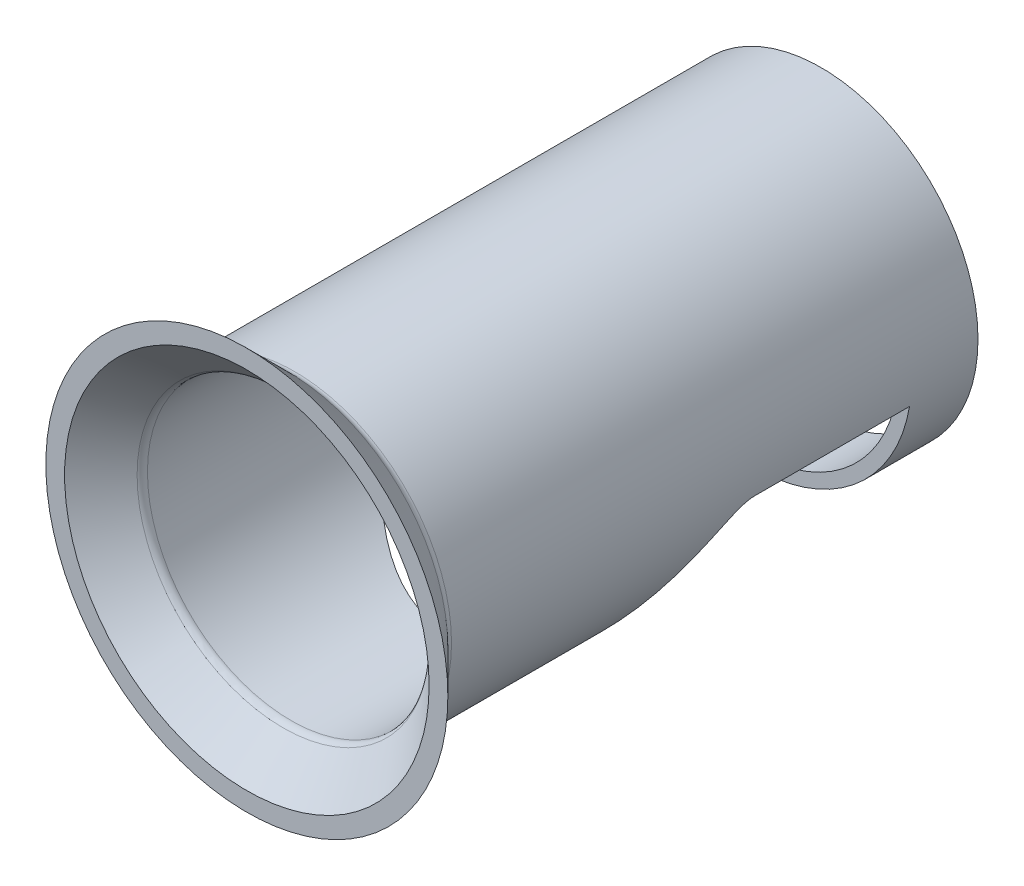
ISO-10303-21;
HEADER;
FILE_DESCRIPTION(('STEP AP214'),'2;1');
FILE_NAME('part.step','',(''),(''),'','','');
FILE_SCHEMA(('AUTOMOTIVE_DESIGN { 1 0 10303 214 1 1 1 1 }'));
ENDSEC;
DATA;
#1=APPLICATION_CONTEXT('core data for automotive mechanical design processes');
#2=APPLICATION_PROTOCOL_DEFINITION('international standard','automotive_design',2000,#1);
#3=PRODUCT_CONTEXT('',#1,'mechanical');
#4=PRODUCT('Part','Part','',(#3));
#5=PRODUCT_RELATED_PRODUCT_CATEGORY('part','',(#4));
#6=PRODUCT_DEFINITION_FORMATION('','',#4);
#7=PRODUCT_DEFINITION_CONTEXT('part definition',#1,'design');
#8=PRODUCT_DEFINITION('design','',#6,#7);
#9=PRODUCT_DEFINITION_SHAPE('','',#8);
#10=(LENGTH_UNIT() NAMED_UNIT(*) SI_UNIT(.MILLI.,.METRE.));
#11=(NAMED_UNIT(*) PLANE_ANGLE_UNIT() SI_UNIT($,.RADIAN.));
#12=(NAMED_UNIT(*) SI_UNIT($,.STERADIAN.) SOLID_ANGLE_UNIT());
#13=UNCERTAINTY_MEASURE_WITH_UNIT(LENGTH_MEASURE(1.E-05),#10,'distance_accuracy_value','');
#14=(GEOMETRIC_REPRESENTATION_CONTEXT(3) GLOBAL_UNCERTAINTY_ASSIGNED_CONTEXT((#13)) GLOBAL_UNIT_ASSIGNED_CONTEXT((#10,
#11,#12)) REPRESENTATION_CONTEXT('',''));
#15=CARTESIAN_POINT('',(0.,0.,0.));
#16=DIRECTION('',(0.,0.,1.));
#17=DIRECTION('',(1.,0.,0.));
#18=AXIS2_PLACEMENT_3D('',#15,#16,#17);
#19=CARTESIAN_POINT('',(0.,0.,0.));
#20=DIRECTION('',(0.,0.,1.));
#21=DIRECTION('',(1.,0.,0.));
#22=AXIS2_PLACEMENT_3D('',#19,#20,#21);
#23=PLANE('',#22);
#24=CARTESIAN_POINT('',(0.,0.,0.));
#25=DIRECTION('',(0.,0.,1.));
#26=DIRECTION('',(1.,0.,0.));
#27=AXIS2_PLACEMENT_3D('',#24,#25,#26);
#28=CIRCLE('',#27,17.75);
#29=CARTESIAN_POINT('',(17.75,0.,0.));
#30=VERTEX_POINT('',#29);
#31=EDGE_CURVE('E240',#30,#30,#28,.T.);
#32=ORIENTED_EDGE('',*,*,#31,.F.);
#33=EDGE_LOOP('',(#32));
#34=FACE_BOUND('',#33,.T.);
#35=CARTESIAN_POINT('',(0.,0.,0.));
#36=DIRECTION('',(0.,0.,1.));
#37=DIRECTION('',(1.,0.,0.));
#38=AXIS2_PLACEMENT_3D('',#35,#36,#37);
#39=CIRCLE('',#38,16.25);
#40=CARTESIAN_POINT('',(16.25,0.,0.));
#41=VERTEX_POINT('',#40);
#42=EDGE_CURVE('E152',#41,#41,#39,.T.);
#43=ORIENTED_EDGE('',*,*,#42,.T.);
#44=EDGE_LOOP('',(#43));
#45=FACE_BOUND('',#44,.T.);
#46=ADVANCED_FACE('F37',(#34,#45),#23,.F.);
#47=CARTESIAN_POINT('',(0.,0.,170.));
#48=DIRECTION('',(0.,0.,-1.));
#49=DIRECTION('',(-1.,0.,0.));
#50=AXIS2_PLACEMENT_3D('',#47,#48,#49);
#51=CYLINDRICAL_SURFACE('',#50,17.75);
#52=CARTESIAN_POINT('',(0.,0.,59.5857864376269));
#53=DIRECTION('',(0.,0.,1.));
#54=DIRECTION('',(1.,0.,0.));
#55=AXIS2_PLACEMENT_3D('',#52,#53,#54);
#56=CIRCLE('',#55,17.75);
#57=CARTESIAN_POINT('',(17.75,0.,59.5857864376269));
#58=VERTEX_POINT('',#57);
#59=EDGE_CURVE('E193',#58,#58,#56,.F.);
#60=ORIENTED_EDGE('',*,*,#59,.T.);
#61=EDGE_LOOP('',(#60));
#62=FACE_BOUND('',#61,.T.);
#63=DIRECTION('',(0.,0.,-1.));
#64=VECTOR('',#63,1.);
#65=CARTESIAN_POINT('',(-17.5,-2.9685855217595,170.));
#66=LINE('',#65,#64);
#67=CARTESIAN_POINT('',(-17.5,-2.9685855217595,7.50000000000001));
#68=VERTEX_POINT('',#67);
#69=CARTESIAN_POINT('',(-17.5,-2.96858552175949,25.));
#70=VERTEX_POINT('',#69);
#71=EDGE_CURVE('E178',#68,#70,#66,.F.);
#72=ORIENTED_EDGE('',*,*,#71,.T.);
#73=CARTESIAN_POINT('',(-17.5,-2.9685855217595,25.));
#74=CARTESIAN_POINT('',(-17.5000170392149,-2.96840485020913,25.1156571313001));
#75=CARTESIAN_POINT('',(-17.4988542765592,-2.97534203245867,25.2311649210221));
#76=CARTESIAN_POINT('',(-17.494317403572,-3.00194286008731,25.4601653083223));
#77=CARTESIAN_POINT('',(-17.4909531483648,-3.02154978367346,25.5736645824291));
#78=CARTESIAN_POINT('',(-17.482266525602,-3.07138944454455,25.7952437173956));
#79=CARTESIAN_POINT('',(-17.4769939554906,-3.10135114841929,25.9033882380726));
#80=CARTESIAN_POINT('',(-17.4646545023751,-3.17010825899014,26.1168105208855));
#81=CARTESIAN_POINT('',(-17.4575855665594,-3.20891376674544,26.2220848496523));
#82=CARTESIAN_POINT('',(-17.4324805866099,-3.34362132504211,26.5525481264265));
#83=CARTESIAN_POINT('',(-17.4113713364061,-3.45271256602485,26.7720867815164));
#84=CARTESIAN_POINT('',(-17.3625592286921,-3.69037875028441,27.1995317028094));
#85=CARTESIAN_POINT('',(-17.3348434462744,-3.81899170407678,27.4074141677498));
#86=CARTESIAN_POINT('',(-17.2727412463586,-4.0908181462468,27.818970742604));
#87=CARTESIAN_POINT('',(-17.2382216517569,-4.2342903312073,28.0224520512979));
#88=CARTESIAN_POINT('',(-17.1632647088974,-4.52857084861795,28.4225255511058));
#89=CARTESIAN_POINT('',(-17.1228328696683,-4.67937226529377,28.6191239466151));
#90=CARTESIAN_POINT('',(-17.0100128675406,-5.0780837541379,29.1244771628138));
#91=CARTESIAN_POINT('',(-16.9330657078337,-5.32967077435075,29.4293083541491));
#92=CARTESIAN_POINT('',(-16.7644184660704,-5.83856814248285,30.0300552735472));
#93=CARTESIAN_POINT('',(-16.6727136225632,-6.09588031440952,30.3259680874573));
#94=CARTESIAN_POINT('',(-16.4743655879751,-6.61321642622657,30.9110751146919));
#95=CARTESIAN_POINT('',(-16.3677025325546,-6.87324353945526,31.2002597878101));
#96=CARTESIAN_POINT('',(-16.1393795866644,-7.39348741376895,31.7723888280794));
#97=CARTESIAN_POINT('',(-16.0177216579991,-7.65370414562686,32.0553340058559));
#98=CARTESIAN_POINT('',(-15.7602522500451,-8.17065620005154,32.6130122341027));
#99=CARTESIAN_POINT('',(-15.6245696940379,-8.42740232388271,32.8877946088255));
#100=CARTESIAN_POINT('',(-15.3379465516999,-8.93844311313583,33.4315983864976));
#101=CARTESIAN_POINT('',(-15.1870052215614,-9.1927376583901,33.7006195078321));
#102=CARTESIAN_POINT('',(-14.7110663106798,-9.949985766382,34.49831216827));
#103=CARTESIAN_POINT('',(-14.3626782123141,-10.447864463478,35.0182135030176));
#104=CARTESIAN_POINT('',(-13.7071218977134,-11.2861144399055,35.8891420005412));
#105=CARTESIAN_POINT('',(-13.4154815369849,-11.6317460512249,36.246887094296));
#106=CARTESIAN_POINT('',(-12.7972446659693,-12.3086588133105,36.9456329297495));
#107=CARTESIAN_POINT('',(-12.470645488525,-12.6399388664227,37.286632390953));
#108=CARTESIAN_POINT('',(-11.7815409459831,-13.2845949414027,37.9488872816949));
#109=CARTESIAN_POINT('',(-11.4190330007209,-13.5979696741589,38.2701412897654));
#110=CARTESIAN_POINT('',(-10.6574602752668,-14.2027217689255,38.8891746941662));
#111=CARTESIAN_POINT('',(-10.2584063704332,-14.4941056282094,39.186961025255));
#112=CARTESIAN_POINT('',(-9.52333128988585,-14.9838046167509,39.68685728132));
#113=CARTESIAN_POINT('',(-9.1950186237191,-15.1877266392807,39.8948316929566));
#114=CARTESIAN_POINT('',(-8.51736835916689,-15.5778604244395,40.2924395877471));
#115=CARTESIAN_POINT('',(-8.16803213500437,-15.7640733425908,40.4820742675855));
#116=CARTESIAN_POINT('',(-7.4494363622276,-16.1160878544419,40.8403566398725));
#117=CARTESIAN_POINT('',(-7.08019971636435,-16.2819122204625,41.0090277492177));
#118=CARTESIAN_POINT('',(-6.32271718030201,-16.5907484368457,41.3230278410211));
#119=CARTESIAN_POINT('',(-5.93447426427894,-16.7337638416255,41.4683604604397));
#120=CARTESIAN_POINT('',(-5.20336772350552,-16.9738432179445,41.7122481457077));
#121=CARTESIAN_POINT('',(-4.86296710613775,-17.0745966121946,41.8145652408423));
#122=CARTESIAN_POINT('',(-4.1716737017371,-17.2565155964438,41.9992672169266));
#123=CARTESIAN_POINT('',(-3.82078196405534,-17.337683138157,42.081654083909));
#124=CARTESIAN_POINT('',(-3.1106499828175,-17.4790549529917,42.2251273338324));
#125=CARTESIAN_POINT('',(-2.75141318610622,-17.5392677226392,42.2862223499888));
#126=CARTESIAN_POINT('',(-2.0268439537539,-17.637688636677,42.3860757957244));
#127=CARTESIAN_POINT('',(-1.66151144532895,-17.6758965181311,42.4248339584008));
#128=CARTESIAN_POINT('',(-0.926319112602328,-17.7296557901001,42.4793654200637));
#129=CARTESIAN_POINT('',(-0.55644875636485,-17.7451364962776,42.49506701028));
#130=CARTESIAN_POINT('',(0.183788181293006,-17.7529074511822,42.5029489919991));
#131=CARTESIAN_POINT('',(0.554154763144654,-17.7451976797415,42.4951293630464));
#132=CARTESIAN_POINT('',(1.29246700958534,-17.706741449882,42.4561222320374));
#133=CARTESIAN_POINT('',(1.66041251408683,-17.6759934832602,42.4249332000956));
#134=CARTESIAN_POINT('',(2.39105292541915,-17.592060443666,42.3397849462172));
#135=CARTESIAN_POINT('',(2.75374787860924,-17.5388755689232,42.2858259254531));
#136=CARTESIAN_POINT('',(3.45490006279455,-17.4139922158867,42.1591006482646));
#137=CARTESIAN_POINT('',(3.79370647336999,-17.3432534956171,42.0873092263387));
#138=CARTESIAN_POINT('',(4.46232728322205,-17.183372557465,41.9250106976147));
#139=CARTESIAN_POINT('',(4.79214222058746,-17.0942314436106,41.8345047135722));
#140=CARTESIAN_POINT('',(5.44136064918908,-16.898788708053,41.6360109536758));
#141=CARTESIAN_POINT('',(5.76076065635137,-16.792481413172,41.528017398396));
#142=CARTESIAN_POINT('',(6.38787404590323,-16.5640872786631,41.2959170838214));
#143=CARTESIAN_POINT('',(6.69558504390356,-16.4419972417103,41.1718070595709));
#144=CARTESIAN_POINT('',(7.41615311915121,-16.1329195985601,40.8574810411537));
#145=CARTESIAN_POINT('',(7.82314706410694,-15.9392069753315,40.6603761771765));
#146=CARTESIAN_POINT('',(8.61126030987007,-15.5276049757867,40.2412460191758));
#147=CARTESIAN_POINT('',(8.99237124994759,-15.3097078467002,40.0192127336415));
#148=CARTESIAN_POINT('',(9.72828656143847,-14.8529672871384,39.5533585315874));
#149=CARTESIAN_POINT('',(10.0830678083917,-14.6141058369864,39.3095188681335));
#150=CARTESIAN_POINT('',(10.7658130438993,-14.1187006254901,38.8031858613466));
#151=CARTESIAN_POINT('',(11.0937772336302,-13.8621569968208,38.5406926579766));
#152=CARTESIAN_POINT('',(11.83980353713,-13.2362565430154,37.8993246523466));
#153=CARTESIAN_POINT('',(12.246256239093,-12.860303566664,37.5133481460053));
#154=CARTESIAN_POINT('',(13.0108488350329,-12.0862120921241,36.7163576634044));
#155=CARTESIAN_POINT('',(13.3689616697554,-11.6880613430092,36.305329849458));
#156=CARTESIAN_POINT('',(14.040141145531,-10.872769530418,35.4602643528113));
#157=CARTESIAN_POINT('',(14.3529601860801,-10.4555393666411,35.0261167236119));
#158=CARTESIAN_POINT('',(14.9327716346214,-9.60925347641577,34.1401534370885));
#159=CARTESIAN_POINT('',(15.1998014062296,-9.18020772640213,33.6883525578933));
#160=CARTESIAN_POINT('',(15.6990250098993,-8.29871783630424,32.7513224801041));
#161=CARTESIAN_POINT('',(15.929568325092,-7.84599471321372,32.2654749511342));
#162=CARTESIAN_POINT('',(16.2413195277913,-7.16551788227929,31.5224111777818));
#163=CARTESIAN_POINT('',(16.3396865279376,-6.93810294800507,31.2719375899919));
#164=CARTESIAN_POINT('',(16.5250182044386,-6.48431050568129,30.765968493473));
#165=CARTESIAN_POINT('',(16.6119855095049,-6.25793277011942,30.5104741581841));
#166=CARTESIAN_POINT('',(16.773820439724,-5.81012289340178,29.9960936788309));
#167=CARTESIAN_POINT('',(16.8487990007389,-5.58866399297696,29.7372658884741));
#168=CARTESIAN_POINT('',(16.9877427599819,-5.15090963818702,29.21194870603));
#169=CARTESIAN_POINT('',(17.0516976679808,-4.93461916884494,28.9454524234889));
#170=CARTESIAN_POINT('',(17.1680461267485,-4.51308633426004,28.4036383112747));
#171=CARTESIAN_POINT('',(17.2205016623039,-4.30778948235074,28.1283774212627));
#172=CARTESIAN_POINT('',(17.2903830103837,-4.01439443389077,27.7042614668141));
#173=CARTESIAN_POINT('',(17.3121961774421,-3.91908995931046,27.5611349783677));
#174=CARTESIAN_POINT('',(17.352756469795,-3.73538965128889,27.2701234463736));
#175=CARTESIAN_POINT('',(17.3715050097465,-3.64699064012393,27.1222406363266));
#176=CARTESIAN_POINT('',(17.3999267586357,-3.50831108440138,26.8715289318693));
#177=CARTESIAN_POINT('',(17.4105257770096,-3.45524401677563,26.7703626343262));
#178=CARTESIAN_POINT('',(17.4301757477769,-3.35471319772819,26.5651309250624));
#179=CARTESIAN_POINT('',(17.4392261347978,-3.30725149465715,26.4610644706107));
#180=CARTESIAN_POINT('',(17.4637039818285,-3.17636935079233,26.1458788273873));
#181=CARTESIAN_POINT('',(17.4766858034263,-3.10330753015647,25.9298204950352));
#182=CARTESIAN_POINT('',(17.4903227745656,-3.02521502291805,25.5932091810819));
#183=CARTESIAN_POINT('',(17.4939038700331,-3.00436021196286,25.4764479871638));
#184=CARTESIAN_POINT('',(17.4987651502811,-2.97586648401234,25.2398763643416));
#185=CARTESIAN_POINT('',(17.5000171008921,-2.96838977896659,25.120046147338));
#186=CARTESIAN_POINT('',(17.5,-2.96858552175951,25.));
#187=B_SPLINE_CURVE_WITH_KNOTS('',3,(#73,#74,#75,#76,#77,#78,#79,#80,#81,#82,#83,#84,#85,#86,
#87,#88,#89,#90,#91,#92,#93,#94,#95,#96,#97,#98,#99,#100,#101,#102,#103,#104,#105,#106,#107,
#108,#109,#110,#111,#112,#113,#114,#115,#116,#117,#118,#119,#120,#121,#122,#123,#124,#125,#126,
#127,#128,#129,#130,#131,#132,#133,#134,#135,#136,#137,#138,#139,#140,#141,#142,#143,#144,#145,
#146,#147,#148,#149,#150,#151,#152,#153,#154,#155,#156,#157,#158,#159,#160,#161,#162,#163,#164,
#165,#166,#167,#168,#169,#170,#171,#172,#173,#174,#175,#176,#177,#178,#179,#180,#181,#182,#183,
#184,#185,#186),.UNSPECIFIED.,.F.,.F.,(4,2,2,2,2,2,2,2,2,2,2,2,2,2,2,2,2,2,2,2,2,2,2,2,2,2,2,2,
2,2,2,2,2,2,2,2,2,2,2,2,2,2,2,2,2,2,2,2,2,2,2,2,2,2,2,2,4),(0.,0.346519790538913,
0.691498877914954,1.02805778376329,1.36500303830801,2.10102100996197,2.83849090686732,
3.59216317021288,4.34513758481376,5.55257109463403,6.76039495732595,7.96983825914539,
9.17912349509514,10.3781426061274,11.5772201930272,13.9727835079892,15.7014046267408,
17.4301577235047,19.1590351271633,20.8873997123744,22.2029698565509,23.5184541005602,
24.8324554468811,26.1462518262953,27.253477701292,28.360593196543,29.4672592655048,
30.5739385577306,31.6840525214969,32.7941674506894,33.9043550602672,35.0145328615602,
36.0738515947904,37.1331067940071,38.1927127811207,39.2525337644304,40.7262128755626,
42.2003657724975,43.6757984101808,45.1512199784294,47.1730050039794,49.1959171139805,
51.229500794641,53.2614171109511,55.3683662783022,56.4251566121271,57.4817028251863,
58.5278225443838,59.5749135558927,60.6162135482872,61.1360513872972,61.6556485830654,
61.9996588671782,62.3437944754446,63.0252792247017,63.3805394585609,63.7400788239137),.UNSPECIFIED.);
#188=CARTESIAN_POINT('',(17.5,-2.96858552175949,25.));
#189=VERTEX_POINT('',#188);
#190=EDGE_CURVE('E144',#70,#189,#187,.T.);
#191=ORIENTED_EDGE('',*,*,#190,.T.);
#192=DIRECTION('',(0.,0.,-1.));
#193=VECTOR('',#192,1.);
#194=CARTESIAN_POINT('',(17.5,-2.9685855217595,170.));
#195=LINE('',#194,#193);
#196=CARTESIAN_POINT('',(17.5,-2.9685855217595,7.50000000000001));
#197=VERTEX_POINT('',#196);
#198=EDGE_CURVE('E113',#189,#197,#195,.T.);
#199=ORIENTED_EDGE('',*,*,#198,.T.);
#200=CARTESIAN_POINT('',(0.,0.,7.50000000000001));
#201=DIRECTION('',(0.,0.,-1.));
#202=DIRECTION('',(-1.,0.,0.));
#203=AXIS2_PLACEMENT_3D('',#200,#201,#202);
#204=CIRCLE('',#203,17.75);
#205=EDGE_CURVE('E136',#197,#68,#204,.T.);
#206=ORIENTED_EDGE('',*,*,#205,.T.);
#207=EDGE_LOOP('',(#72,#191,#199,#206));
#208=FACE_BOUND('',#207,.T.);
#209=ORIENTED_EDGE('',*,*,#31,.T.);
#210=EDGE_LOOP('',(#209));
#211=FACE_BOUND('',#210,.T.);
#212=ADVANCED_FACE('F154',(#62,#208,#211),#51,.T.);
#213=CARTESIAN_POINT('',(0.,0.,170.));
#214=DIRECTION('',(0.,0.,-1.));
#215=DIRECTION('',(-1.,0.,0.));
#216=AXIS2_PLACEMENT_3D('',#213,#214,#215);
#217=CYLINDRICAL_SURFACE('',#216,16.25);
#218=CARTESIAN_POINT('',(0.,0.,60.));
#219=DIRECTION('',(0.,0.,-1.));
#220=DIRECTION('',(-1.,0.,0.));
#221=AXIS2_PLACEMENT_3D('',#218,#219,#220);
#222=CIRCLE('',#221,16.25);
#223=CARTESIAN_POINT('',(-16.25,0.,60.));
#224=VERTEX_POINT('',#223);
#225=EDGE_CURVE('E127',#224,#224,#222,.T.);
#226=ORIENTED_EDGE('',*,*,#225,.F.);
#227=EDGE_LOOP('',(#226));
#228=FACE_BOUND('',#227,.T.);
#229=DIRECTION('',(0.,0.,-1.));
#230=VECTOR('',#229,1.);
#231=CARTESIAN_POINT('',(16.25,0.,170.));
#232=LINE('',#231,#230);
#233=CARTESIAN_POINT('',(16.25,0.,31.4951905283833));
#234=VERTEX_POINT('',#233);
#235=CARTESIAN_POINT('',(16.25,0.,8.50000000000001));
#236=VERTEX_POINT('',#235);
#237=EDGE_CURVE('E173',#234,#236,#232,.T.);
#238=ORIENTED_EDGE('',*,*,#237,.F.);
#239=CARTESIAN_POINT('',(-16.25,0.,31.4951905283833));
#240=CARTESIAN_POINT('',(-16.2500026249748,-0.111930454347152,31.4951765798849));
#241=CARTESIAN_POINT('',(-16.2488430731494,-0.223836579637184,31.4980856807682));
#242=CARTESIAN_POINT('',(-16.2442271038538,-0.447274798330244,31.5096193634038));
#243=CARTESIAN_POINT('',(-16.2407713543672,-0.558806991032652,31.5182422829554));
#244=CARTESIAN_POINT('',(-16.2270332887393,-0.891645979444915,31.5524057545126));
#245=CARTESIAN_POINT('',(-16.2133797212121,-1.11201099892201,31.5862429462679));
#246=CARTESIAN_POINT('',(-16.1779495224688,-1.54351274834414,31.6727838903841));
#247=CARTESIAN_POINT('',(-16.1563437381234,-1.754746012492,31.7250899560987));
#248=CARTESIAN_POINT('',(-16.1055894165481,-2.17178797762399,31.8457489689829));
#249=CARTESIAN_POINT('',(-16.0764338513947,-2.37759142636829,31.914116862222));
#250=CARTESIAN_POINT('',(-15.993363882028,-2.89409896982871,32.1047986947685));
#251=CARTESIAN_POINT('',(-15.9346263942668,-3.20066630124389,32.2361753700775));
#252=CARTESIAN_POINT('',(-15.8023908007897,-3.80017219821599,32.5205769691175));
#253=CARTESIAN_POINT('',(-15.7288838259661,-4.09310244386425,32.6736148840694));
#254=CARTESIAN_POINT('',(-15.5673125848315,-4.67035022568446,32.9963594471173));
#255=CARTESIAN_POINT('',(-15.4790809699888,-4.95451823351468,33.166247374961));
#256=CARTESIAN_POINT('',(-15.2894529619304,-5.51196731259369,33.515998267463));
#257=CARTESIAN_POINT('',(-15.1880586341857,-5.78525008316174,33.6958596645697));
#258=CARTESIAN_POINT('',(-14.9781655330739,-6.30810162159511,34.0523526798766));
#259=CARTESIAN_POINT('',(-14.8703231991827,-6.55816100766203,34.2286545966863));
#260=CARTESIAN_POINT('',(-14.6432944951392,-7.05052631352138,34.5848078869365));
#261=CARTESIAN_POINT('',(-14.5241064824076,-7.29283110383036,34.7646597713296));
#262=CARTESIAN_POINT('',(-14.2743576069245,-7.77031817228243,35.1262543885592));
#263=CARTESIAN_POINT('',(-14.1437901206554,-8.00549619345575,35.3079981676658));
#264=CARTESIAN_POINT('',(-13.8712947111715,-8.46887850980841,35.6718736593512));
#265=CARTESIAN_POINT('',(-13.7293657144735,-8.69708214319687,35.8540054070006));
#266=CARTESIAN_POINT('',(-13.2875565588608,-9.36966423256024,36.397729184873));
#267=CARTESIAN_POINT('',(-12.9706318385214,-9.80396748864408,36.7581521589016));
#268=CARTESIAN_POINT('',(-12.2903767398639,-10.6442951736865,37.4674839623283));
#269=CARTESIAN_POINT('',(-11.9270726515753,-11.0503354235145,37.8163991749566));
#270=CARTESIAN_POINT('',(-11.2529044198783,-11.7303349344925,38.4077571081372));
#271=CARTESIAN_POINT('',(-10.952770649749,-12.0112992587536,38.6544025888597));
#272=CARTESIAN_POINT('',(-10.3258576066279,-12.5543267159121,39.1344437263325));
#273=CARTESIAN_POINT('',(-9.99907845518022,-12.8163899350175,39.3678394435141));
#274=CARTESIAN_POINT('',(-9.31908597499064,-13.3189983959337,39.8179194667056));
#275=CARTESIAN_POINT('',(-8.96589706843671,-13.5595630771895,40.034618844955));
#276=CARTESIAN_POINT('',(-8.23316508733314,-14.0165545068854,40.4480362396737));
#277=CARTESIAN_POINT('',(-7.85362805811363,-14.232986762779,40.6447588142904));
#278=CARTESIAN_POINT('',(-7.14970746765712,-14.5968262469402,40.9765602696202));
#279=CARTESIAN_POINT('',(-6.82998509415616,-14.7492845814043,41.1160055056068));
#280=CARTESIAN_POINT('',(-6.17544799605798,-15.0350856513343,41.3779740931086));
#281=CARTESIAN_POINT('',(-5.84063666746613,-15.1684326601398,41.5005012273283));
#282=CARTESIAN_POINT('',(-5.15733663003038,-15.4141536170485,41.7266651189215));
#283=CARTESIAN_POINT('',(-4.80885326663081,-15.5265356649803,41.8303091714249));
#284=CARTESIAN_POINT('',(-4.09991828334251,-15.7286045437964,42.0169032613634));
#285=CARTESIAN_POINT('',(-3.73946653337072,-15.8182911279149,42.0998530737916));
#286=CARTESIAN_POINT('',(-3.00636143434579,-15.9739062129135,42.2439063549693));
#287=CARTESIAN_POINT('',(-2.63363941317616,-16.0396607629432,42.3048498457538));
#288=CARTESIAN_POINT('',(-1.88139250988562,-16.145187950914,42.4027067771763));
#289=CARTESIAN_POINT('',(-1.50186760744086,-16.1849605112197,42.4396201460112));
#290=CARTESIAN_POINT('',(-0.739500719244498,-16.2376591873783,42.4885385248961));
#291=CARTESIAN_POINT('',(-0.356660077424426,-16.2505957119416,42.500553192234));
#292=CARTESIAN_POINT('',(0.40891950598518,-16.2493622719996,42.4994077928605));
#293=CARTESIAN_POINT('',(0.791658453615262,-16.2351947375368,42.4862499830136));
#294=CARTESIAN_POINT('',(1.51065163604727,-16.1831826725816,42.4379707174876));
#295=CARTESIAN_POINT('',(1.84729582127961,-16.1481780855971,42.4054838927007));
#296=CARTESIAN_POINT('',(2.51538848917961,-16.0576751962291,42.3215514776074));
#297=CARTESIAN_POINT('',(2.84683744258108,-16.0021787619089,42.2701076154498));
#298=CARTESIAN_POINT('',(3.50248775032226,-15.8715732859962,42.1491612556421));
#299=CARTESIAN_POINT('',(3.82668873745753,-15.7964632531515,42.0796578452807));
#300=CARTESIAN_POINT('',(4.46606843482687,-15.6277340871747,41.9237269639384));
#301=CARTESIAN_POINT('',(4.78124662496168,-15.5341138895145,41.8372985195936));
#302=CARTESIAN_POINT('',(5.41266952984691,-15.325798967411,41.6452972475944));
#303=CARTESIAN_POINT('',(5.72851706163585,-15.2104493840407,41.5391314538108));
#304=CARTESIAN_POINT('',(6.34769770660718,-14.9626352589189,41.3115159807706));
#305=CARTESIAN_POINT('',(6.65103088543074,-14.8301708069544,41.1900663816954));
#306=CARTESIAN_POINT('',(7.24441522431624,-14.549525881156,40.9333919848839));
#307=CARTESIAN_POINT('',(7.53446192139304,-14.4013401811158,40.7981626069371));
#308=CARTESIAN_POINT('',(8.10062655827848,-14.0906588405428,40.5154767256632));
#309=CARTESIAN_POINT('',(8.37674149928956,-13.9281601396429,40.3680176078019));
#310=CARTESIAN_POINT('',(9.05572132902871,-13.501512687077,39.9821964497156));
#311=CARTESIAN_POINT('',(9.44915866695232,-13.2287302126845,39.7367017486101));
#312=CARTESIAN_POINT('',(10.202468238402,-12.6568557403359,39.2255764786473));
#313=CARTESIAN_POINT('',(10.5623253760324,-12.3577520260124,38.9599369500752));
#314=CARTESIAN_POINT('',(11.2492977441654,-11.7358798640139,38.4125510156259));
#315=CARTESIAN_POINT('',(11.5763484902867,-11.4130668891477,38.1307745341367));
#316=CARTESIAN_POINT('',(12.1974611985465,-10.7467158912279,37.5559140983375));
#317=CARTESIAN_POINT('',(12.4915285767342,-10.4031812850679,37.2628320111231));
#318=CARTESIAN_POINT('',(13.0541430988669,-9.68832878907614,36.6624422874522));
#319=CARTESIAN_POINT('',(13.3219090923935,-9.31654218109852,36.3549620560478));
#320=CARTESIAN_POINT('',(13.8244540244932,-8.55312400443746,35.7374567688943));
#321=CARTESIAN_POINT('',(14.0592225324007,-8.16148621368983,35.4274309411011));
#322=CARTESIAN_POINT('',(14.4962176347291,-7.35743246786754,34.8108208764407));
#323=CARTESIAN_POINT('',(14.6984311986852,-6.94500827911067,34.5042380631241));
#324=CARTESIAN_POINT('',(14.9769981505103,-6.30915240167039,34.0537738954636));
#325=CARTESIAN_POINT('',(15.0657125451572,-6.09437641677932,33.90521707879));
#326=CARTESIAN_POINT('',(15.2347895253551,-5.658477460959,33.6127615234654));
#327=CARTESIAN_POINT('',(15.3151534484722,-5.43735551378047,33.4688620413598));
#328=CARTESIAN_POINT('',(15.4631035525265,-5.0005115738149,33.195440326835));
#329=CARTESIAN_POINT('',(15.5311509510139,-4.78516898541634,33.0655632373826));
#330=CARTESIAN_POINT('',(15.6593024951661,-4.34749841398093,32.8138452478789));
#331=CARTESIAN_POINT('',(15.7194068599174,-4.12517062382097,32.6920041262242));
#332=CARTESIAN_POINT('',(15.8307947372776,-3.67449489594634,32.460051184825));
#333=CARTESIAN_POINT('',(15.8821411708835,-3.44620478722704,32.3498580670021));
#334=CARTESIAN_POINT('',(15.9759166592148,-2.98140373364149,32.1437319401091));
#335=CARTESIAN_POINT('',(16.0183463195002,-2.74489334830663,32.0477979627953));
#336=CARTESIAN_POINT('',(16.0866936092885,-2.30667329054625,31.8901605158166));
#337=CARTESIAN_POINT('',(16.1142076351514,-2.10632111186084,31.8254036288826));
#338=CARTESIAN_POINT('',(16.1620642778422,-1.70055049587836,31.7112972759828));
#339=CARTESIAN_POINT('',(16.1824125760645,-1.49513621100619,31.6619356073836));
#340=CARTESIAN_POINT('',(16.2156963391757,-1.07635172898169,31.5805166073789));
#341=CARTESIAN_POINT('',(16.2284923465647,-0.86290491964305,31.5487854205027));
#342=CARTESIAN_POINT('',(16.2413608482695,-0.540675032138845,31.5167720084749));
#343=CARTESIAN_POINT('',(16.2445961809748,-0.432746674209485,31.5086977261675));
#344=CARTESIAN_POINT('',(16.2489171720016,-0.216552938345156,31.4979002154496));
#345=CARTESIAN_POINT('',(16.2500022811114,-0.108287481378778,31.4951783541599));
#346=CARTESIAN_POINT('',(16.25,0.,31.4951905283833));
#347=B_SPLINE_CURVE_WITH_KNOTS('',3,(#239,#240,#241,#242,#243,#244,#245,#246,#247,#248,#249,
#250,#251,#252,#253,#254,#255,#256,#257,#258,#259,#260,#261,#262,#263,#264,#265,#266,#267,#268,
#269,#270,#271,#272,#273,#274,#275,#276,#277,#278,#279,#280,#281,#282,#283,#284,#285,#286,#287,
#288,#289,#290,#291,#292,#293,#294,#295,#296,#297,#298,#299,#300,#301,#302,#303,#304,#305,#306,
#307,#308,#309,#310,#311,#312,#313,#314,#315,#316,#317,#318,#319,#320,#321,#322,#323,#324,#325,
#326,#327,#328,#329,#330,#331,#332,#333,#334,#335,#336,#337,#338,#339,#340,#341,#342,#343,#344,
#345,#346),.UNSPECIFIED.,.F.,.F.,(4,2,2,2,2,2,2,2,2,2,2,2,2,2,2,2,2,2,2,2,2,2,2,2,2,2,2,2,2,2,2,
2,2,2,2,2,2,2,2,2,2,2,2,2,2,2,2,2,2,2,2,2,2,4),(0.,0.335701617007563,0.6713056182772,
1.34007951524627,1.99525247295242,2.65103752288996,3.66520497950108,4.67998327576429,
5.7071967708467,6.73424927170296,7.70715107059114,8.68019393692711,9.65380700259066,
10.6275121681302,12.5669420312536,14.5052773746945,15.9424198749709,17.3795558200213,
18.8153788416661,20.2508735090606,21.3918403658271,22.5325517002112,23.6728214030178,
24.813103503348,25.9615156478608,27.1099312238676,28.2579012884033,29.405768435311,
30.4246298472106,31.4433984013075,32.4622184529447,33.4810971144491,34.537909980454,
35.5947173024859,36.6518770458154,37.7092633794493,39.3209150762629,40.9332878315091,
42.5487702018323,44.1639869115651,45.8179395580635,47.472413856829,49.1275487390085,
49.9547762422547,50.7818710365009,51.5631489699403,52.3444053494937,53.1197879526041,
53.8951178805388,54.5315271746108,55.1674307452816,55.8147363580948,56.139434494547,
56.464215554959),.UNSPECIFIED.);
#348=CARTESIAN_POINT('',(-16.25,0.,31.4951905283833));
#349=VERTEX_POINT('',#348);
#350=EDGE_CURVE('E125',#349,#234,#347,.T.);
#351=ORIENTED_EDGE('',*,*,#350,.F.);
#352=DIRECTION('',(0.,0.,-1.));
#353=VECTOR('',#352,1.);
#354=CARTESIAN_POINT('',(-16.25,0.,170.));
#355=LINE('',#354,#353);
#356=CARTESIAN_POINT('',(-16.25,0.,8.50000000000001));
#357=VERTEX_POINT('',#356);
#358=EDGE_CURVE('E244',#357,#349,#355,.F.);
#359=ORIENTED_EDGE('',*,*,#358,.F.);
#360=CARTESIAN_POINT('',(-16.25,0.,8.5));
#361=CARTESIAN_POINT('',(-16.2499995790948,-1.87257181522445E-07,8.47186630190521));
#362=CARTESIAN_POINT('',(-16.2500000473014,-0.00118800228684249,8.44374608174215));
#363=CARTESIAN_POINT('',(-16.2499991739716,-0.00592668130171674,8.38770684604029));
#364=CARTESIAN_POINT('',(-16.2499978325217,-0.00947743231366769,8.35978782094675));
#365=CARTESIAN_POINT('',(-16.2499857258487,-0.0236404257144849,8.27668095005485));
#366=CARTESIAN_POINT('',(-16.2499669004623,-0.0377635015906032,8.22204975274869));
#367=CARTESIAN_POINT('',(-16.2498375426417,-0.074980260929423,8.11593521790819));
#368=CARTESIAN_POINT('',(-16.2497269659646,-0.098078269301685,8.06445341189157));
#369=CARTESIAN_POINT('',(-16.2493063613587,-0.152586548321075,7.96610013756028));
#370=CARTESIAN_POINT('',(-16.2489963684334,-0.183995359603816,7.91922786179928));
#371=CARTESIAN_POINT('',(-16.2480490544727,-0.2542269388532,7.83143214813562));
#372=CARTESIAN_POINT('',(-16.2474117885009,-0.293048458942529,7.79050771099552));
#373=CARTESIAN_POINT('',(-16.245680062616,-0.377012697758047,7.71575112236082));
#374=CARTESIAN_POINT('',(-16.2445855205876,-0.422156550849656,7.68192024633305));
#375=CARTESIAN_POINT('',(-16.2418294196302,-0.517441413445021,7.6223358101096));
#376=CARTESIAN_POINT('',(-16.2401681297947,-0.567580043431986,7.59657842771482));
#377=CARTESIAN_POINT('',(-16.2362054454544,-0.671435459995022,7.55385335233013));
#378=CARTESIAN_POINT('',(-16.2339044101398,-0.72515022588848,7.5368807423196));
#379=CARTESIAN_POINT('',(-16.2295400423681,-0.815991223041249,7.5163762119699));
#380=CARTESIAN_POINT('',(-16.2276611326847,-0.852559510495776,7.5102375823072));
#381=CARTESIAN_POINT('',(-16.2236320770005,-0.926082944561496,7.50204995485107));
#382=CARTESIAN_POINT('',(-16.2214823243468,-0.963037460275932,7.49999509733843));
#383=CARTESIAN_POINT('',(-16.2192015833086,-1.,7.5));
#384=B_SPLINE_CURVE_WITH_KNOTS('',3,(#360,#361,#362,#363,#364,#365,#366,#367,#368,#369,#370,
#371,#372,#373,#374,#375,#376,#377,#378,#379,#380,#381,#382,#383),.UNSPECIFIED.,.F.,.F.,(4,2,2,
2,2,2,2,2,2,2,2,4),(0.,0.0843492552587013,0.168694478023056,0.337107827928137,0.505602435005845,
0.674067474298746,0.842504178652325,1.01097114306083,1.17935822999739,1.34765096496259,
1.45882038842184,1.56983018169945),.UNSPECIFIED.);
#385=CARTESIAN_POINT('',(-16.2192015833086,-1.,7.50000000000001));
#386=VERTEX_POINT('',#385);
#387=EDGE_CURVE('E51',#357,#386,#384,.T.);
#388=ORIENTED_EDGE('',*,*,#387,.T.);
#389=CARTESIAN_POINT('',(0.,0.,7.50000000000001));
#390=DIRECTION('',(0.,0.,-1.));
#391=DIRECTION('',(-1.,0.,0.));
#392=AXIS2_PLACEMENT_3D('',#389,#390,#391);
#393=CIRCLE('',#392,16.25);
#394=CARTESIAN_POINT('',(16.2192015833086,-1.,7.50000000000001));
#395=VERTEX_POINT('',#394);
#396=EDGE_CURVE('E174',#395,#386,#393,.T.);
#397=ORIENTED_EDGE('',*,*,#396,.F.);
#398=CARTESIAN_POINT('',(16.2192015833086,-1.,7.5));
#399=CARTESIAN_POINT('',(16.2209330430765,-0.971923706444314,7.50000018460552));
#400=CARTESIAN_POINT('',(16.2225898770777,-0.943856148869509,7.50118317229742));
#401=CARTESIAN_POINT('',(16.2257479067332,-0.887912141022161,7.5059048648565));
#402=CARTESIAN_POINT('',(16.227249107924,-0.860035683984427,7.50944348589176));
#403=CARTESIAN_POINT('',(16.2315052455591,-0.777040373994909,7.52356278559967));
#404=CARTESIAN_POINT('',(16.23401838164,-0.722463245743625,7.53764697783499));
#405=CARTESIAN_POINT('',(16.2383913285627,-0.616419730048197,7.57478202060158));
#406=CARTESIAN_POINT('',(16.2402507854976,-0.564955040147936,7.59783771418701));
#407=CARTESIAN_POINT('',(16.2433738066488,-0.466613365534233,7.65226507511587));
#408=CARTESIAN_POINT('',(16.2446374872165,-0.419735486463665,7.68363511684821));
#409=CARTESIAN_POINT('',(16.2466685761192,-0.331949481715169,7.75376781969105));
#410=CARTESIAN_POINT('',(16.2474364801029,-0.291035425543811,7.79252304714649));
#411=CARTESIAN_POINT('',(16.248603839343,-0.21627469551195,7.87635827852133));
#412=CARTESIAN_POINT('',(16.2490032197561,-0.182429458334539,7.92143956505691));
#413=CARTESIAN_POINT('',(16.2495638072869,-0.122760963325732,8.01666566798862));
#414=CARTESIAN_POINT('',(16.2497248650938,-0.0969427424688325,8.06681363770033));
#415=CARTESIAN_POINT('',(16.2499241549887,-0.0540990432718856,8.17072093595957));
#416=CARTESIAN_POINT('',(16.2499624579429,-0.0370684965960353,8.22447816258386));
#417=CARTESIAN_POINT('',(16.249993715232,-0.0164715975208241,8.31546430242275));
#418=CARTESIAN_POINT('',(16.2499976351113,-0.0102986281373136,8.35212445716558));
#419=CARTESIAN_POINT('',(16.25000001553,-0.0020632665138986,8.42585131044354));
#420=CARTESIAN_POINT('',(16.2499984837312,4.88831159465745E-06,8.46291736548998));
#421=CARTESIAN_POINT('',(16.25,0.,8.5));
#422=B_SPLINE_CURVE_WITH_KNOTS('',3,(#398,#399,#400,#401,#402,#403,#404,#405,#406,#407,#408,
#409,#410,#411,#412,#413,#414,#415,#416,#417,#418,#419,#420,#421),.UNSPECIFIED.,.F.,.F.,(4,2,2,
2,2,2,2,2,2,2,2,4),(0.,0.0843373914835733,0.168671781741376,0.337066559782591,0.505552368179979,
0.674005258710307,0.842289477957664,1.0106078664666,1.17903166303468,1.34735821143682,
1.45867261405966,1.56983063598361),.UNSPECIFIED.);
#423=EDGE_CURVE('E12',#395,#236,#422,.T.);
#424=ORIENTED_EDGE('',*,*,#423,.T.);
#425=EDGE_LOOP('',(#238,#351,#359,#388,#397,#424));
#426=FACE_BOUND('',#425,.T.);
#427=ORIENTED_EDGE('',*,*,#42,.F.);
#428=EDGE_LOOP('',(#427));
#429=FACE_BOUND('',#428,.T.);
#430=ADVANCED_FACE('F163',(#228,#426,#429),#217,.F.);
#431=CARTESIAN_POINT('',(-17.5,-170.,25.));
#432=DIRECTION('',(-1.,0.,0.));
#433=DIRECTION('',(0.,0.,1.));
#434=AXIS2_PLACEMENT_3D('',#431,#432,#433);
#435=PLANE('',#434);
#436=DIRECTION('',(0.,1.,0.));
#437=VECTOR('',#436,1.);
#438=CARTESIAN_POINT('',(-17.5,-170.,7.5));
#439=LINE('',#438,#437);
#440=CARTESIAN_POINT('',(-17.5,-1.,7.5));
#441=VERTEX_POINT('',#440);
#442=EDGE_CURVE('E137',#68,#441,#439,.T.);
#443=ORIENTED_EDGE('',*,*,#442,.T.);
#444=CARTESIAN_POINT('',(-17.5,-1.,8.5));
#445=DIRECTION('',(-1.,0.,0.));
#446=DIRECTION('',(0.,0.,1.));
#447=AXIS2_PLACEMENT_3D('',#444,#445,#446);
#448=CIRCLE('',#447,1.);
#449=CARTESIAN_POINT('',(-17.5,0.,8.5));
#450=VERTEX_POINT('',#449);
#451=EDGE_CURVE('E202',#441,#450,#448,.F.);
#452=ORIENTED_EDGE('',*,*,#451,.T.);
#453=DIRECTION('',(0.,0.,1.));
#454=VECTOR('',#453,1.);
#455=CARTESIAN_POINT('',(-17.5,0.,25.));
#456=LINE('',#455,#454);
#457=CARTESIAN_POINT('',(-17.5,0.,25.));
#458=VERTEX_POINT('',#457);
#459=EDGE_CURVE('E117',#450,#458,#456,.T.);
#460=ORIENTED_EDGE('',*,*,#459,.T.);
#461=DIRECTION('',(0.,1.,0.));
#462=VECTOR('',#461,1.);
#463=CARTESIAN_POINT('',(-17.5,-170.,25.));
#464=LINE('',#463,#462);
#465=EDGE_CURVE('E134',#70,#458,#464,.T.);
#466=ORIENTED_EDGE('',*,*,#465,.F.);
#467=ORIENTED_EDGE('',*,*,#71,.F.);
#468=EDGE_LOOP('',(#443,#452,#460,#466,#467));
#469=FACE_BOUND('',#468,.T.);
#470=ADVANCED_FACE('F258',(#469),#435,.F.);
#471=CARTESIAN_POINT('',(17.5,-170.,7.5));
#472=DIRECTION('',(1.,0.,0.));
#473=DIRECTION('',(0.,0.,-1.));
#474=AXIS2_PLACEMENT_3D('',#471,#472,#473);
#475=PLANE('',#474);
#476=DIRECTION('',(0.,0.,-1.));
#477=VECTOR('',#476,1.);
#478=CARTESIAN_POINT('',(17.5,0.,7.5));
#479=LINE('',#478,#477);
#480=CARTESIAN_POINT('',(17.5,0.,25.));
#481=VERTEX_POINT('',#480);
#482=CARTESIAN_POINT('',(17.5,0.,8.5));
#483=VERTEX_POINT('',#482);
#484=EDGE_CURVE('E110',#481,#483,#479,.T.);
#485=ORIENTED_EDGE('',*,*,#484,.T.);
#486=CARTESIAN_POINT('',(17.5,-1.,8.5));
#487=DIRECTION('',(1.,0.,0.));
#488=DIRECTION('',(0.,0.,-1.));
#489=AXIS2_PLACEMENT_3D('',#486,#487,#488);
#490=CIRCLE('',#489,1.);
#491=CARTESIAN_POINT('',(17.5,-1.,7.5));
#492=VERTEX_POINT('',#491);
#493=EDGE_CURVE('E207',#483,#492,#490,.F.);
#494=ORIENTED_EDGE('',*,*,#493,.T.);
#495=DIRECTION('',(0.,1.,0.));
#496=VECTOR('',#495,1.);
#497=CARTESIAN_POINT('',(17.5,-170.,7.5));
#498=LINE('',#497,#496);
#499=EDGE_CURVE('E116',#197,#492,#498,.T.);
#500=ORIENTED_EDGE('',*,*,#499,.F.);
#501=ORIENTED_EDGE('',*,*,#198,.F.);
#502=DIRECTION('',(0.,1.,0.));
#503=VECTOR('',#502,1.);
#504=CARTESIAN_POINT('',(17.5,-170.,25.));
#505=LINE('',#504,#503);
#506=EDGE_CURVE('E107',#189,#481,#505,.T.);
#507=ORIENTED_EDGE('',*,*,#506,.T.);
#508=EDGE_LOOP('',(#485,#494,#500,#501,#507));
#509=FACE_BOUND('',#508,.T.);
#510=ADVANCED_FACE('F109',(#509),#475,.F.);
#511=CARTESIAN_POINT('',(0.,-170.,25.));
#512=DIRECTION('',(0.,1.,0.));
#513=DIRECTION('',(0.,0.,1.));
#514=AXIS2_PLACEMENT_3D('',#511,#512,#513);
#515=CYLINDRICAL_SURFACE('',#514,17.5);
#516=ORIENTED_EDGE('',*,*,#465,.T.);
#517=CARTESIAN_POINT('',(0.,0.,25.));
#518=DIRECTION('',(0.,1.,0.));
#519=DIRECTION('',(0.,0.,1.));
#520=AXIS2_PLACEMENT_3D('',#517,#518,#519);
#521=CIRCLE('',#520,17.5);
#522=EDGE_CURVE('E126',#458,#349,#521,.T.);
#523=ORIENTED_EDGE('',*,*,#522,.T.);
#524=ORIENTED_EDGE('',*,*,#350,.T.);
#525=EDGE_CURVE('E120',#234,#481,#521,.T.);
#526=ORIENTED_EDGE('',*,*,#525,.T.);
#527=ORIENTED_EDGE('',*,*,#506,.F.);
#528=ORIENTED_EDGE('',*,*,#190,.F.);
#529=EDGE_LOOP('',(#516,#523,#524,#526,#527,#528));
#530=FACE_BOUND('',#529,.T.);
#531=ADVANCED_FACE('F122',(#530),#515,.F.);
#532=CARTESIAN_POINT('',(-17.5,-170.,7.5));
#533=DIRECTION('',(0.,0.,-1.));
#534=DIRECTION('',(-1.,0.,0.));
#535=AXIS2_PLACEMENT_3D('',#532,#533,#534);
#536=PLANE('',#535);
#537=ORIENTED_EDGE('',*,*,#396,.T.);
#538=DIRECTION('',(-1.,0.,0.));
#539=VECTOR('',#538,1.);
#540=CARTESIAN_POINT('',(-17.5,-1.,7.5));
#541=LINE('',#540,#539);
#542=EDGE_CURVE('E199',#386,#441,#541,.T.);
#543=ORIENTED_EDGE('',*,*,#542,.T.);
#544=ORIENTED_EDGE('',*,*,#442,.F.);
#545=ORIENTED_EDGE('',*,*,#205,.F.);
#546=ORIENTED_EDGE('',*,*,#499,.T.);
#547=DIRECTION('',(-1.,0.,0.));
#548=VECTOR('',#547,1.);
#549=CARTESIAN_POINT('',(16.25,-1.,7.5));
#550=LINE('',#549,#548);
#551=EDGE_CURVE('E196',#492,#395,#550,.T.);
#552=ORIENTED_EDGE('',*,*,#551,.T.);
#553=EDGE_LOOP('',(#537,#543,#544,#545,#546,#552));
#554=FACE_BOUND('',#553,.T.);
#555=ADVANCED_FACE('F161',(#554),#536,.F.);
#556=CARTESIAN_POINT('',(0.,0.,25.));
#557=DIRECTION('',(0.,1.,0.));
#558=DIRECTION('',(0.,0.,1.));
#559=AXIS2_PLACEMENT_3D('',#556,#557,#558);
#560=PLANE('',#559);
#561=ORIENTED_EDGE('',*,*,#237,.T.);
#562=DIRECTION('',(-1.,0.,0.));
#563=VECTOR('',#562,1.);
#564=CARTESIAN_POINT('',(17.5,0.,8.5));
#565=LINE('',#564,#563);
#566=EDGE_CURVE('E58',#236,#483,#565,.F.);
#567=ORIENTED_EDGE('',*,*,#566,.T.);
#568=ORIENTED_EDGE('',*,*,#484,.F.);
#569=ORIENTED_EDGE('',*,*,#525,.F.);
#570=EDGE_LOOP('',(#561,#567,#568,#569));
#571=FACE_BOUND('',#570,.T.);
#572=ADVANCED_FACE('F129',(#571),#560,.F.);
#573=ORIENTED_EDGE('',*,*,#459,.F.);
#574=DIRECTION('',(-1.,0.,0.));
#575=VECTOR('',#574,1.);
#576=CARTESIAN_POINT('',(-16.25,0.,8.5));
#577=LINE('',#576,#575);
#578=EDGE_CURVE('E204',#450,#357,#577,.F.);
#579=ORIENTED_EDGE('',*,*,#578,.T.);
#580=ORIENTED_EDGE('',*,*,#358,.T.);
#581=ORIENTED_EDGE('',*,*,#522,.F.);
#582=EDGE_LOOP('',(#573,#579,#580,#581));
#583=FACE_BOUND('',#582,.T.);
#584=ADVANCED_FACE('F260',(#583),#560,.F.);
#585=CARTESIAN_POINT('',(0.,0.,65.));
#586=DIRECTION('',(0.,0.,1.));
#587=DIRECTION('',(1.,0.,0.));
#588=AXIS2_PLACEMENT_3D('',#585,#586,#587);
#589=PLANE('',#588);
#590=CARTESIAN_POINT('',(0.,0.,65.));
#591=DIRECTION('',(0.,0.,1.));
#592=DIRECTION('',(1.,0.,0.));
#593=AXIS2_PLACEMENT_3D('',#590,#591,#592);
#594=CIRCLE('',#593,20.6286796564404);
#595=CARTESIAN_POINT('',(20.6286796564404,0.,65.));
#596=VERTEX_POINT('',#595);
#597=EDGE_CURVE('E185',#596,#596,#594,.F.);
#598=ORIENTED_EDGE('',*,*,#597,.T.);
#599=EDGE_LOOP('',(#598));
#600=FACE_BOUND('',#599,.T.);
#601=CARTESIAN_POINT('',(0.,0.,65.));
#602=DIRECTION('',(0.,0.,1.));
#603=DIRECTION('',(1.,0.,0.));
#604=AXIS2_PLACEMENT_3D('',#601,#602,#603);
#605=CIRCLE('',#604,22.75);
#606=CARTESIAN_POINT('',(22.75,0.,65.));
#607=VERTEX_POINT('',#606);
#608=EDGE_CURVE('E184',#607,#607,#605,.T.);
#609=ORIENTED_EDGE('',*,*,#608,.T.);
#610=EDGE_LOOP('',(#609));
#611=FACE_BOUND('',#610,.T.);
#612=ADVANCED_FACE('F294',(#600,#611),#589,.T.);
#613=CARTESIAN_POINT('',(0.,0.,60.));
#614=DIRECTION('',(0.,0.,1.));
#615=DIRECTION('',(1.,0.,0.));
#616=AXIS2_PLACEMENT_3D('',#613,#614,#615);
#617=CONICAL_SURFACE('',#616,17.75,0.785398163397448);
#618=CARTESIAN_POINT('',(0.,0.,60.2928932188135));
#619=DIRECTION('',(0.,0.,-1.));
#620=DIRECTION('',(-1.,0.,0.));
#621=AXIS2_PLACEMENT_3D('',#618,#619,#620);
#622=CIRCLE('',#621,18.0428932188135);
#623=CARTESIAN_POINT('',(-18.0428932188135,0.,60.2928932188135));
#624=VERTEX_POINT('',#623);
#625=EDGE_CURVE('E190',#624,#624,#622,.F.);
#626=ORIENTED_EDGE('',*,*,#625,.T.);
#627=EDGE_LOOP('',(#626));
#628=FACE_BOUND('',#627,.T.);
#629=ORIENTED_EDGE('',*,*,#608,.F.);
#630=EDGE_LOOP('',(#629));
#631=FACE_BOUND('',#630,.T.);
#632=ADVANCED_FACE('F227',(#628,#631),#617,.T.);
#633=CARTESIAN_POINT('',(0.,0.,67.4738621099111));
#634=DIRECTION('',(0.,0.,1.));
#635=DIRECTION('',(1.,0.,0.));
#636=AXIS2_PLACEMENT_3D('',#633,#634,#635);
#637=CONICAL_SURFACE('',#636,23.1025417663515,0.785398163397448);
#638=CARTESIAN_POINT('',(0.,0.,60.8961771108088));
#639=DIRECTION('',(0.,0.,1.));
#640=DIRECTION('',(1.,0.,0.));
#641=AXIS2_PLACEMENT_3D('',#638,#639,#640);
#642=CIRCLE('',#641,16.5248567672492);
#643=CARTESIAN_POINT('',(16.5248567672492,0.,60.8961771108088));
#644=VERTEX_POINT('',#643);
#645=EDGE_CURVE('E181',#644,#644,#642,.F.);
#646=ORIENTED_EDGE('',*,*,#645,.T.);
#647=EDGE_LOOP('',(#646));
#648=FACE_BOUND('',#647,.T.);
#649=ORIENTED_EDGE('',*,*,#597,.F.);
#650=EDGE_LOOP('',(#649));
#651=FACE_BOUND('',#650,.T.);
#652=ADVANCED_FACE('F222',(#648,#651),#637,.F.);
#653=CARTESIAN_POINT('',(0.,0.,60.1890703296222));
#654=DIRECTION('',(0.,0.,-1.));
#655=DIRECTION('',(-1.,0.,0.));
#656=AXIS2_PLACEMENT_3D('',#653,#654,#655);
#657=TOROIDAL_SURFACE('',#656,17.2319635484357,1.);
#658=ORIENTED_EDGE('',*,*,#225,.T.);
#659=EDGE_LOOP('',(#658));
#660=FACE_BOUND('',#659,.T.);
#661=ORIENTED_EDGE('',*,*,#645,.F.);
#662=EDGE_LOOP('',(#661));
#663=FACE_BOUND('',#662,.T.);
#664=ADVANCED_FACE('F219',(#660,#663),#657,.T.);
#665=CARTESIAN_POINT('',(0.,0.,59.5857864376269));
#666=DIRECTION('',(0.,0.,1.));
#667=DIRECTION('',(1.,0.,0.));
#668=AXIS2_PLACEMENT_3D('',#665,#666,#667);
#669=TOROIDAL_SURFACE('',#668,18.75,1.);
#670=ORIENTED_EDGE('',*,*,#59,.F.);
#671=EDGE_LOOP('',(#670));
#672=FACE_BOUND('',#671,.T.);
#673=ORIENTED_EDGE('',*,*,#625,.F.);
#674=EDGE_LOOP('',(#673));
#675=FACE_BOUND('',#674,.T.);
#676=ADVANCED_FACE('F216',(#672,#675),#669,.F.);
#677=CARTESIAN_POINT('',(-17.5,-1.,8.5));
#678=DIRECTION('',(1.,0.,0.));
#679=DIRECTION('',(0.,0.,-1.));
#680=AXIS2_PLACEMENT_3D('',#677,#678,#679);
#681=CYLINDRICAL_SURFACE('',#680,1.);
#682=ORIENTED_EDGE('',*,*,#387,.F.);
#683=ORIENTED_EDGE('',*,*,#578,.F.);
#684=ORIENTED_EDGE('',*,*,#451,.F.);
#685=ORIENTED_EDGE('',*,*,#542,.F.);
#686=EDGE_LOOP('',(#682,#683,#684,#685));
#687=FACE_BOUND('',#686,.T.);
#688=ADVANCED_FACE('F212',(#687),#681,.F.);
#689=CARTESIAN_POINT('',(-17.5,-1.,8.5));
#690=DIRECTION('',(1.,0.,0.));
#691=DIRECTION('',(0.,0.,-1.));
#692=AXIS2_PLACEMENT_3D('',#689,#690,#691);
#693=CYLINDRICAL_SURFACE('',#692,1.);
#694=ORIENTED_EDGE('',*,*,#493,.F.);
#695=ORIENTED_EDGE('',*,*,#566,.F.);
#696=ORIENTED_EDGE('',*,*,#423,.F.);
#697=ORIENTED_EDGE('',*,*,#551,.F.);
#698=EDGE_LOOP('',(#694,#695,#696,#697));
#699=FACE_BOUND('',#698,.T.);
#700=ADVANCED_FACE('F39',(#699),#693,.F.);
#701=CLOSED_SHELL('',(#46,#212,#430,#470,#510,#531,#555,#572,#584,#612,#632,#652,#664,#676,#688,#700));
#702=MANIFOLD_SOLID_BREP('B2',#701);
#703=ADVANCED_BREP_SHAPE_REPRESENTATION('',(#18,#702),#14);
#704=SHAPE_DEFINITION_REPRESENTATION(#9,#703);
ENDSEC;
END-ISO-10303-21;
